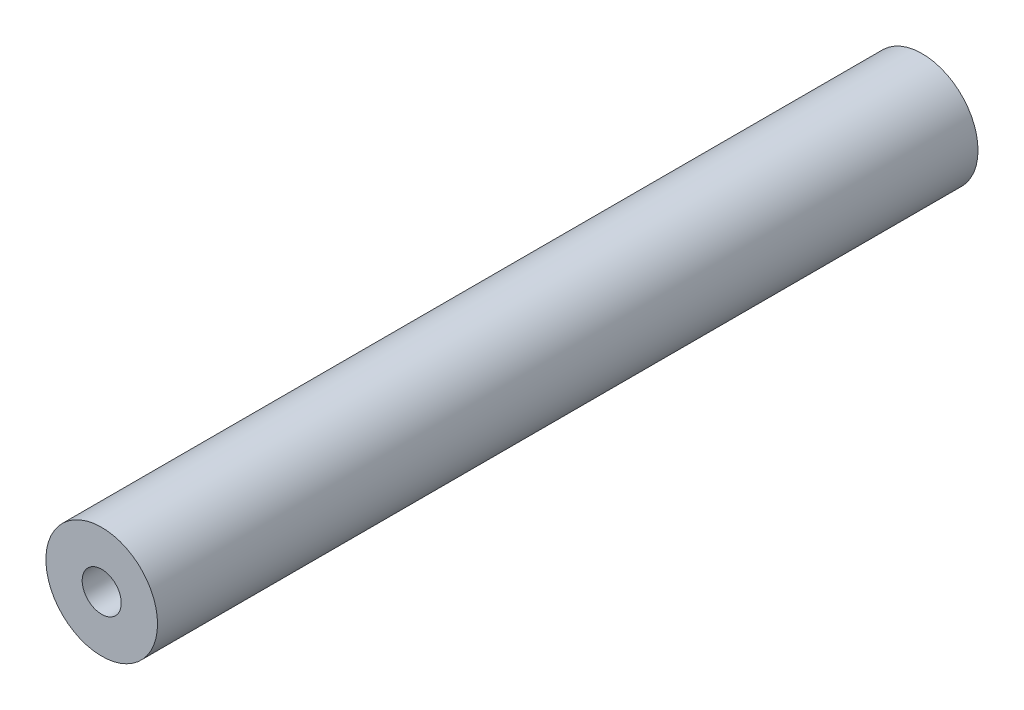
ISO-10303-21;
HEADER;
FILE_DESCRIPTION(('STEP AP214'),'2;1');
FILE_NAME('part.step','',(''),(''),'','','');
FILE_SCHEMA(('AUTOMOTIVE_DESIGN { 1 0 10303 214 1 1 1 1 }'));
ENDSEC;
DATA;
#1=APPLICATION_CONTEXT('core data for automotive mechanical design processes');
#2=APPLICATION_PROTOCOL_DEFINITION('international standard','automotive_design',2000,#1);
#3=PRODUCT_CONTEXT('',#1,'mechanical');
#4=PRODUCT('Part','Part','',(#3));
#5=PRODUCT_RELATED_PRODUCT_CATEGORY('part','',(#4));
#6=PRODUCT_DEFINITION_FORMATION('','',#4);
#7=PRODUCT_DEFINITION_CONTEXT('part definition',#1,'design');
#8=PRODUCT_DEFINITION('design','',#6,#7);
#9=PRODUCT_DEFINITION_SHAPE('','',#8);
#10=(LENGTH_UNIT() NAMED_UNIT(*) SI_UNIT(.MILLI.,.METRE.));
#11=(NAMED_UNIT(*) PLANE_ANGLE_UNIT() SI_UNIT($,.RADIAN.));
#12=(NAMED_UNIT(*) SI_UNIT($,.STERADIAN.) SOLID_ANGLE_UNIT());
#13=UNCERTAINTY_MEASURE_WITH_UNIT(LENGTH_MEASURE(1.E-05),#10,'distance_accuracy_value','');
#14=(GEOMETRIC_REPRESENTATION_CONTEXT(3) GLOBAL_UNCERTAINTY_ASSIGNED_CONTEXT((#13)) GLOBAL_UNIT_ASSIGNED_CONTEXT((#10,
#11,#12)) REPRESENTATION_CONTEXT('',''));
#15=CARTESIAN_POINT('',(0.,0.,0.));
#16=DIRECTION('',(0.,0.,1.));
#17=DIRECTION('',(1.,0.,0.));
#18=AXIS2_PLACEMENT_3D('',#15,#16,#17);
#19=CARTESIAN_POINT('',(0.,0.,73.5));
#20=DIRECTION('',(0.,0.,1.));
#21=DIRECTION('',(1.,0.,0.));
#22=AXIS2_PLACEMENT_3D('',#19,#20,#21);
#23=PLANE('',#22);
#24=CARTESIAN_POINT('',(0.,0.,73.5));
#25=DIRECTION('',(0.,0.,1.));
#26=DIRECTION('',(1.,0.,0.));
#27=AXIS2_PLACEMENT_3D('',#24,#25,#26);
#28=CIRCLE('',#27,5.);
#29=CARTESIAN_POINT('',(5.,0.,73.5));
#30=VERTEX_POINT('',#29);
#31=EDGE_CURVE('E10',#30,#30,#28,.T.);
#32=ORIENTED_EDGE('',*,*,#31,.T.);
#33=EDGE_LOOP('',(#32));
#34=FACE_BOUND('',#33,.T.);
#35=CARTESIAN_POINT('',(0.,0.,73.5));
#36=DIRECTION('',(0.,0.,1.));
#37=DIRECTION('',(1.,0.,0.));
#38=AXIS2_PLACEMENT_3D('',#35,#36,#37);
#39=CIRCLE('',#38,1.75);
#40=CARTESIAN_POINT('',(1.75,0.,73.5));
#41=VERTEX_POINT('',#40);
#42=EDGE_CURVE('E44',#41,#41,#39,.T.);
#43=ORIENTED_EDGE('',*,*,#42,.F.);
#44=EDGE_LOOP('',(#43));
#45=FACE_BOUND('',#44,.T.);
#46=ADVANCED_FACE('F33',(#34,#45),#23,.T.);
#47=CARTESIAN_POINT('',(0.,0.,0.));
#48=DIRECTION('',(0.,0.,1.));
#49=DIRECTION('',(1.,0.,0.));
#50=AXIS2_PLACEMENT_3D('',#47,#48,#49);
#51=PLANE('',#50);
#52=CARTESIAN_POINT('',(0.,0.,0.));
#53=DIRECTION('',(0.,0.,1.));
#54=DIRECTION('',(1.,0.,0.));
#55=AXIS2_PLACEMENT_3D('',#52,#53,#54);
#56=CIRCLE('',#55,5.);
#57=CARTESIAN_POINT('',(5.,0.,0.));
#58=VERTEX_POINT('',#57);
#59=EDGE_CURVE('E37',#58,#58,#56,.T.);
#60=ORIENTED_EDGE('',*,*,#59,.F.);
#61=EDGE_LOOP('',(#60));
#62=FACE_BOUND('',#61,.T.);
#63=CARTESIAN_POINT('',(0.,0.,0.));
#64=DIRECTION('',(0.,0.,1.));
#65=DIRECTION('',(1.,0.,0.));
#66=AXIS2_PLACEMENT_3D('',#63,#64,#65);
#67=CIRCLE('',#66,1.75);
#68=CARTESIAN_POINT('',(1.75,0.,0.));
#69=VERTEX_POINT('',#68);
#70=EDGE_CURVE('E46',#69,#69,#67,.T.);
#71=ORIENTED_EDGE('',*,*,#70,.T.);
#72=EDGE_LOOP('',(#71));
#73=FACE_BOUND('',#72,.T.);
#74=ADVANCED_FACE('F56',(#62,#73),#51,.F.);
#75=CARTESIAN_POINT('',(0.,0.,73.5));
#76=DIRECTION('',(0.,0.,-1.));
#77=DIRECTION('',(-1.,0.,0.));
#78=AXIS2_PLACEMENT_3D('',#75,#76,#77);
#79=CYLINDRICAL_SURFACE('',#78,5.);
#80=ORIENTED_EDGE('',*,*,#31,.F.);
#81=EDGE_LOOP('',(#80));
#82=FACE_BOUND('',#81,.T.);
#83=ORIENTED_EDGE('',*,*,#59,.T.);
#84=EDGE_LOOP('',(#83));
#85=FACE_BOUND('',#84,.T.);
#86=ADVANCED_FACE('F35',(#82,#85),#79,.T.);
#87=CARTESIAN_POINT('',(0.,0.,73.5));
#88=DIRECTION('',(0.,0.,-1.));
#89=DIRECTION('',(-1.,0.,0.));
#90=AXIS2_PLACEMENT_3D('',#87,#88,#89);
#91=CYLINDRICAL_SURFACE('',#90,1.75);
#92=ORIENTED_EDGE('',*,*,#42,.T.);
#93=EDGE_LOOP('',(#92));
#94=FACE_BOUND('',#93,.T.);
#95=ORIENTED_EDGE('',*,*,#70,.F.);
#96=EDGE_LOOP('',(#95));
#97=FACE_BOUND('',#96,.T.);
#98=ADVANCED_FACE('F52',(#94,#97),#91,.F.);
#99=CLOSED_SHELL('',(#46,#74,#86,#98));
#100=MANIFOLD_SOLID_BREP('B2',#99);
#101=ADVANCED_BREP_SHAPE_REPRESENTATION('',(#18,#100),#14);
#102=SHAPE_DEFINITION_REPRESENTATION(#9,#101);
ENDSEC;
END-ISO-10303-21;
